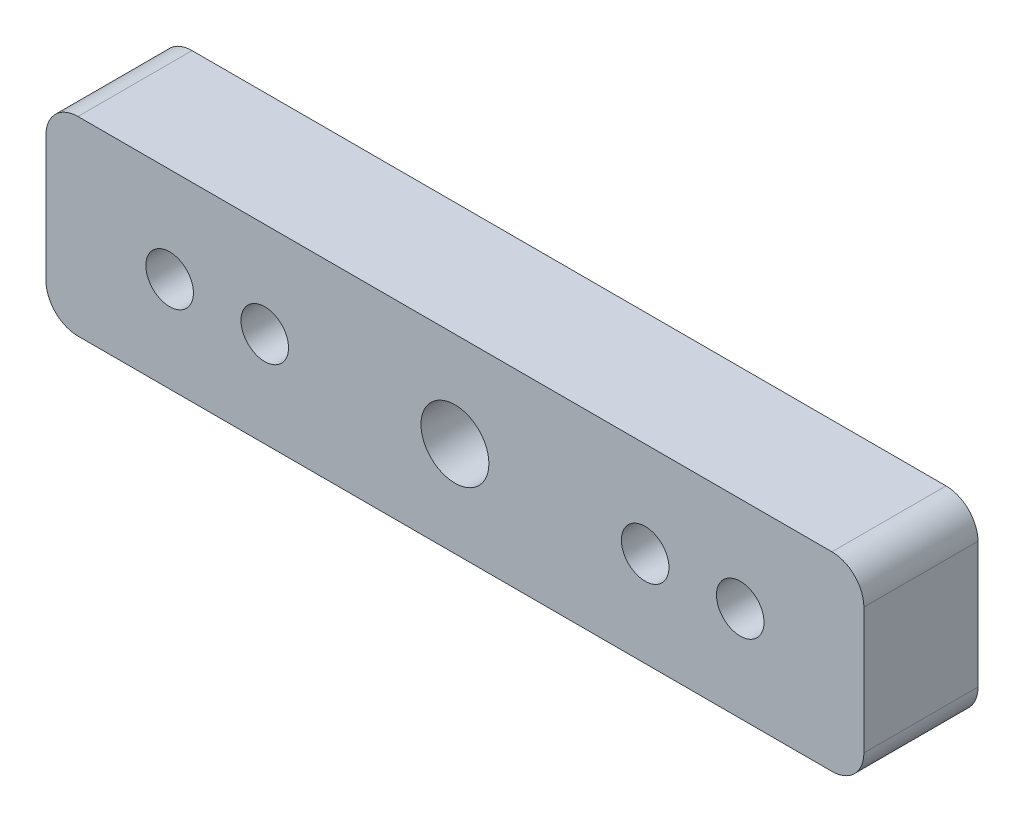
ISO-10303-21;
HEADER;
FILE_DESCRIPTION(('STEP AP214'),'2;1');
FILE_NAME('part.step','',(''),(''),'','','');
FILE_SCHEMA(('AUTOMOTIVE_DESIGN { 1 0 10303 214 1 1 1 1 }'));
ENDSEC;
DATA;
#1=APPLICATION_CONTEXT('core data for automotive mechanical design processes');
#2=APPLICATION_PROTOCOL_DEFINITION('international standard','automotive_design',2000,#1);
#3=PRODUCT_CONTEXT('',#1,'mechanical');
#4=PRODUCT('Part','Part','',(#3));
#5=PRODUCT_RELATED_PRODUCT_CATEGORY('part','',(#4));
#6=PRODUCT_DEFINITION_FORMATION('','',#4);
#7=PRODUCT_DEFINITION_CONTEXT('part definition',#1,'design');
#8=PRODUCT_DEFINITION('design','',#6,#7);
#9=PRODUCT_DEFINITION_SHAPE('','',#8);
#10=(LENGTH_UNIT() NAMED_UNIT(*) SI_UNIT(.MILLI.,.METRE.));
#11=(NAMED_UNIT(*) PLANE_ANGLE_UNIT() SI_UNIT($,.RADIAN.));
#12=(NAMED_UNIT(*) SI_UNIT($,.STERADIAN.) SOLID_ANGLE_UNIT());
#13=UNCERTAINTY_MEASURE_WITH_UNIT(LENGTH_MEASURE(1.E-05),#10,'distance_accuracy_value','');
#14=(GEOMETRIC_REPRESENTATION_CONTEXT(3) GLOBAL_UNCERTAINTY_ASSIGNED_CONTEXT((#13)) GLOBAL_UNIT_ASSIGNED_CONTEXT((#10,
#11,#12)) REPRESENTATION_CONTEXT('',''));
#15=CARTESIAN_POINT('',(0.,0.,0.));
#16=DIRECTION('',(0.,0.,1.));
#17=DIRECTION('',(1.,0.,0.));
#18=AXIS2_PLACEMENT_3D('',#15,#16,#17);
#19=CARTESIAN_POINT('',(39.64,6.64,6.));
#20=DIRECTION('',(0.,0.,-1.));
#21=DIRECTION('',(-1.,0.,0.));
#22=AXIS2_PLACEMENT_3D('',#19,#20,#21);
#23=PLANE('',#22);
#24=CARTESIAN_POINT('',(-20.,0.,6.));
#25=DIRECTION('',(0.,0.,1.));
#26=DIRECTION('',(1.,0.,0.));
#27=AXIS2_PLACEMENT_3D('',#24,#25,#26);
#28=CIRCLE('',#27,2.5);
#29=CARTESIAN_POINT('',(-17.5,0.,6.));
#30=VERTEX_POINT('',#29);
#31=EDGE_CURVE('E194',#30,#30,#28,.T.);
#32=ORIENTED_EDGE('',*,*,#31,.F.);
#33=EDGE_LOOP('',(#32));
#34=FACE_BOUND('',#33,.T.);
#35=CARTESIAN_POINT('',(0.,0.,6.));
#36=DIRECTION('',(0.,0.,1.));
#37=DIRECTION('',(1.,0.,0.));
#38=AXIS2_PLACEMENT_3D('',#35,#36,#37);
#39=CIRCLE('',#38,3.57);
#40=CARTESIAN_POINT('',(3.57,0.,6.));
#41=VERTEX_POINT('',#40);
#42=EDGE_CURVE('E182',#41,#41,#39,.T.);
#43=ORIENTED_EDGE('',*,*,#42,.F.);
#44=EDGE_LOOP('',(#43));
#45=FACE_BOUND('',#44,.T.);
#46=CARTESIAN_POINT('',(39.64,6.64,6.));
#47=DIRECTION('',(0.,0.,1.));
#48=DIRECTION('',(-1.,0.,0.));
#49=AXIS2_PLACEMENT_3D('',#46,#47,#48);
#50=CIRCLE('',#49,3.36);
#51=CARTESIAN_POINT('',(43.,6.63999999999998,6.));
#52=VERTEX_POINT('',#51);
#53=CARTESIAN_POINT('',(39.64,10.,6.));
#54=VERTEX_POINT('',#53);
#55=EDGE_CURVE('E145',#52,#54,#50,.T.);
#56=ORIENTED_EDGE('',*,*,#55,.T.);
#57=DIRECTION('',(-1.,0.,0.));
#58=VECTOR('',#57,1.);
#59=CARTESIAN_POINT('',(-39.64,10.,6.));
#60=LINE('',#59,#58);
#61=CARTESIAN_POINT('',(-39.64,10.,6.));
#62=VERTEX_POINT('',#61);
#63=EDGE_CURVE('E93',#54,#62,#60,.T.);
#64=ORIENTED_EDGE('',*,*,#63,.T.);
#65=CARTESIAN_POINT('',(-39.64,6.64,6.));
#66=DIRECTION('',(0.,0.,1.));
#67=DIRECTION('',(-1.,0.,0.));
#68=AXIS2_PLACEMENT_3D('',#65,#66,#67);
#69=CIRCLE('',#68,3.36);
#70=CARTESIAN_POINT('',(-43.,6.63999999999998,6.));
#71=VERTEX_POINT('',#70);
#72=EDGE_CURVE('E160',#62,#71,#69,.T.);
#73=ORIENTED_EDGE('',*,*,#72,.T.);
#74=DIRECTION('',(0.,-1.,0.));
#75=VECTOR('',#74,1.);
#76=CARTESIAN_POINT('',(-43.,-6.63999999999998,6.));
#77=LINE('',#76,#75);
#78=CARTESIAN_POINT('',(-43.,-6.63999999999998,6.));
#79=VERTEX_POINT('',#78);
#80=EDGE_CURVE('E173',#71,#79,#77,.T.);
#81=ORIENTED_EDGE('',*,*,#80,.T.);
#82=CARTESIAN_POINT('',(-39.64,-6.64,6.));
#83=DIRECTION('',(0.,0.,1.));
#84=DIRECTION('',(-1.,0.,0.));
#85=AXIS2_PLACEMENT_3D('',#82,#83,#84);
#86=CIRCLE('',#85,3.36);
#87=CARTESIAN_POINT('',(-39.64,-10.,6.));
#88=VERTEX_POINT('',#87);
#89=EDGE_CURVE('E112',#79,#88,#86,.T.);
#90=ORIENTED_EDGE('',*,*,#89,.T.);
#91=DIRECTION('',(1.,0.,0.));
#92=VECTOR('',#91,1.);
#93=CARTESIAN_POINT('',(-39.64,-10.,6.));
#94=LINE('',#93,#92);
#95=CARTESIAN_POINT('',(39.64,-10.,6.));
#96=VERTEX_POINT('',#95);
#97=EDGE_CURVE('E106',#88,#96,#94,.T.);
#98=ORIENTED_EDGE('',*,*,#97,.T.);
#99=CARTESIAN_POINT('',(39.64,-6.64,6.));
#100=DIRECTION('',(0.,0.,1.));
#101=DIRECTION('',(1.,0.,0.));
#102=AXIS2_PLACEMENT_3D('',#99,#100,#101);
#103=CIRCLE('',#102,3.36);
#104=CARTESIAN_POINT('',(43.,-6.63999999999998,6.));
#105=VERTEX_POINT('',#104);
#106=EDGE_CURVE('E110',#96,#105,#103,.T.);
#107=ORIENTED_EDGE('',*,*,#106,.T.);
#108=DIRECTION('',(0.,1.,0.));
#109=VECTOR('',#108,1.);
#110=CARTESIAN_POINT('',(43.,-6.63999999999998,6.));
#111=LINE('',#110,#109);
#112=EDGE_CURVE('E50',#105,#52,#111,.T.);
#113=ORIENTED_EDGE('',*,*,#112,.T.);
#114=EDGE_LOOP('',(#56,#64,#73,#81,#90,#98,#107,#113));
#115=FACE_BOUND('',#114,.T.);
#116=CARTESIAN_POINT('',(-30.,0.,6.));
#117=DIRECTION('',(0.,0.,1.));
#118=DIRECTION('',(1.,0.,0.));
#119=AXIS2_PLACEMENT_3D('',#116,#117,#118);
#120=CIRCLE('',#119,2.5);
#121=CARTESIAN_POINT('',(-27.5,0.,6.));
#122=VERTEX_POINT('',#121);
#123=EDGE_CURVE('E134',#122,#122,#120,.T.);
#124=ORIENTED_EDGE('',*,*,#123,.F.);
#125=EDGE_LOOP('',(#124));
#126=FACE_BOUND('',#125,.T.);
#127=CARTESIAN_POINT('',(30.,0.,6.));
#128=DIRECTION('',(0.,0.,1.));
#129=DIRECTION('',(1.,0.,0.));
#130=AXIS2_PLACEMENT_3D('',#127,#128,#129);
#131=CIRCLE('',#130,2.5);
#132=CARTESIAN_POINT('',(32.5,0.,6.));
#133=VERTEX_POINT('',#132);
#134=EDGE_CURVE('E188',#133,#133,#131,.T.);
#135=ORIENTED_EDGE('',*,*,#134,.F.);
#136=EDGE_LOOP('',(#135));
#137=FACE_BOUND('',#136,.T.);
#138=CARTESIAN_POINT('',(20.,0.,6.));
#139=DIRECTION('',(0.,0.,1.));
#140=DIRECTION('',(1.,0.,0.));
#141=AXIS2_PLACEMENT_3D('',#138,#139,#140);
#142=CIRCLE('',#141,2.5);
#143=CARTESIAN_POINT('',(22.5,0.,6.));
#144=VERTEX_POINT('',#143);
#145=EDGE_CURVE('E200',#144,#144,#142,.T.);
#146=ORIENTED_EDGE('',*,*,#145,.F.);
#147=EDGE_LOOP('',(#146));
#148=FACE_BOUND('',#147,.T.);
#149=ADVANCED_FACE('F33',(#34,#45,#115,#126,#137,#148),#23,.F.);
#150=CARTESIAN_POINT('',(39.64,6.64,-6.));
#151=DIRECTION('',(0.,0.,-1.));
#152=DIRECTION('',(-1.,0.,0.));
#153=AXIS2_PLACEMENT_3D('',#150,#151,#152);
#154=PLANE('',#153);
#155=CARTESIAN_POINT('',(-20.,0.,-6.));
#156=DIRECTION('',(0.,0.,1.));
#157=DIRECTION('',(1.,0.,0.));
#158=AXIS2_PLACEMENT_3D('',#155,#156,#157);
#159=CIRCLE('',#158,2.5);
#160=CARTESIAN_POINT('',(-17.5,0.,-6.));
#161=VERTEX_POINT('',#160);
#162=EDGE_CURVE('E197',#161,#161,#159,.T.);
#163=ORIENTED_EDGE('',*,*,#162,.T.);
#164=EDGE_LOOP('',(#163));
#165=FACE_BOUND('',#164,.T.);
#166=CARTESIAN_POINT('',(0.,0.,-6.));
#167=DIRECTION('',(0.,0.,1.));
#168=DIRECTION('',(1.,0.,0.));
#169=AXIS2_PLACEMENT_3D('',#166,#167,#168);
#170=CIRCLE('',#169,3.57);
#171=CARTESIAN_POINT('',(3.57,0.,-6.));
#172=VERTEX_POINT('',#171);
#173=EDGE_CURVE('E185',#172,#172,#170,.T.);
#174=ORIENTED_EDGE('',*,*,#173,.T.);
#175=EDGE_LOOP('',(#174));
#176=FACE_BOUND('',#175,.T.);
#177=CARTESIAN_POINT('',(39.64,6.64,-6.));
#178=DIRECTION('',(0.,0.,1.));
#179=DIRECTION('',(-1.,0.,0.));
#180=AXIS2_PLACEMENT_3D('',#177,#178,#179);
#181=CIRCLE('',#180,3.36);
#182=CARTESIAN_POINT('',(43.,6.63999999999998,-6.));
#183=VERTEX_POINT('',#182);
#184=CARTESIAN_POINT('',(39.64,10.,-6.));
#185=VERTEX_POINT('',#184);
#186=EDGE_CURVE('E130',#183,#185,#181,.T.);
#187=ORIENTED_EDGE('',*,*,#186,.F.);
#188=DIRECTION('',(0.,1.,0.));
#189=VECTOR('',#188,1.);
#190=CARTESIAN_POINT('',(43.,-6.63999999999998,-6.));
#191=LINE('',#190,#189);
#192=CARTESIAN_POINT('',(43.,-6.63999999999998,-6.));
#193=VERTEX_POINT('',#192);
#194=EDGE_CURVE('E85',#193,#183,#191,.T.);
#195=ORIENTED_EDGE('',*,*,#194,.F.);
#196=CARTESIAN_POINT('',(39.64,-6.64,-6.));
#197=DIRECTION('',(0.,0.,1.));
#198=DIRECTION('',(1.,0.,0.));
#199=AXIS2_PLACEMENT_3D('',#196,#197,#198);
#200=CIRCLE('',#199,3.36);
#201=CARTESIAN_POINT('',(39.64,-10.,-6.));
#202=VERTEX_POINT('',#201);
#203=EDGE_CURVE('E79',#202,#193,#200,.T.);
#204=ORIENTED_EDGE('',*,*,#203,.F.);
#205=DIRECTION('',(1.,0.,0.));
#206=VECTOR('',#205,1.);
#207=CARTESIAN_POINT('',(-39.64,-10.,-6.));
#208=LINE('',#207,#206);
#209=CARTESIAN_POINT('',(-39.64,-10.,-6.));
#210=VERTEX_POINT('',#209);
#211=EDGE_CURVE('E120',#210,#202,#208,.T.);
#212=ORIENTED_EDGE('',*,*,#211,.F.);
#213=CARTESIAN_POINT('',(-39.64,-6.64,-6.));
#214=DIRECTION('',(0.,0.,1.));
#215=DIRECTION('',(-1.,0.,0.));
#216=AXIS2_PLACEMENT_3D('',#213,#214,#215);
#217=CIRCLE('',#216,3.36);
#218=CARTESIAN_POINT('',(-43.,-6.63999999999998,-6.));
#219=VERTEX_POINT('',#218);
#220=EDGE_CURVE('E140',#219,#210,#217,.T.);
#221=ORIENTED_EDGE('',*,*,#220,.F.);
#222=DIRECTION('',(0.,-1.,0.));
#223=VECTOR('',#222,1.);
#224=CARTESIAN_POINT('',(-43.,-6.63999999999998,-6.));
#225=LINE('',#224,#223);
#226=CARTESIAN_POINT('',(-43.,6.63999999999998,-6.));
#227=VERTEX_POINT('',#226);
#228=EDGE_CURVE('E138',#227,#219,#225,.T.);
#229=ORIENTED_EDGE('',*,*,#228,.F.);
#230=CARTESIAN_POINT('',(-39.64,6.64,-6.));
#231=DIRECTION('',(0.,0.,1.));
#232=DIRECTION('',(-1.,0.,0.));
#233=AXIS2_PLACEMENT_3D('',#230,#231,#232);
#234=CIRCLE('',#233,3.36);
#235=CARTESIAN_POINT('',(-39.64,10.,-6.));
#236=VERTEX_POINT('',#235);
#237=EDGE_CURVE('E136',#236,#227,#234,.T.);
#238=ORIENTED_EDGE('',*,*,#237,.F.);
#239=DIRECTION('',(-1.,0.,0.));
#240=VECTOR('',#239,1.);
#241=CARTESIAN_POINT('',(-39.64,10.,-6.));
#242=LINE('',#241,#240);
#243=EDGE_CURVE('E133',#185,#236,#242,.T.);
#244=ORIENTED_EDGE('',*,*,#243,.F.);
#245=EDGE_LOOP('',(#187,#195,#204,#212,#221,#229,#238,#244));
#246=FACE_BOUND('',#245,.T.);
#247=CARTESIAN_POINT('',(-30.,0.,-6.));
#248=DIRECTION('',(0.,0.,1.));
#249=DIRECTION('',(1.,0.,0.));
#250=AXIS2_PLACEMENT_3D('',#247,#248,#249);
#251=CIRCLE('',#250,2.5);
#252=CARTESIAN_POINT('',(-27.5,0.,-6.));
#253=VERTEX_POINT('',#252);
#254=EDGE_CURVE('E179',#253,#253,#251,.T.);
#255=ORIENTED_EDGE('',*,*,#254,.T.);
#256=EDGE_LOOP('',(#255));
#257=FACE_BOUND('',#256,.T.);
#258=CARTESIAN_POINT('',(30.,0.,-6.));
#259=DIRECTION('',(0.,0.,1.));
#260=DIRECTION('',(1.,0.,0.));
#261=AXIS2_PLACEMENT_3D('',#258,#259,#260);
#262=CIRCLE('',#261,2.5);
#263=CARTESIAN_POINT('',(32.5,0.,-6.));
#264=VERTEX_POINT('',#263);
#265=EDGE_CURVE('E191',#264,#264,#262,.T.);
#266=ORIENTED_EDGE('',*,*,#265,.T.);
#267=EDGE_LOOP('',(#266));
#268=FACE_BOUND('',#267,.T.);
#269=CARTESIAN_POINT('',(20.,0.,-6.));
#270=DIRECTION('',(0.,0.,1.));
#271=DIRECTION('',(1.,0.,0.));
#272=AXIS2_PLACEMENT_3D('',#269,#270,#271);
#273=CIRCLE('',#272,2.5);
#274=CARTESIAN_POINT('',(22.5,0.,-6.));
#275=VERTEX_POINT('',#274);
#276=EDGE_CURVE('E203',#275,#275,#273,.T.);
#277=ORIENTED_EDGE('',*,*,#276,.T.);
#278=EDGE_LOOP('',(#277));
#279=FACE_BOUND('',#278,.T.);
#280=ADVANCED_FACE('F164',(#165,#176,#246,#257,#268,#279),#154,.T.);
#281=CARTESIAN_POINT('',(39.64,6.64,6.));
#282=DIRECTION('',(0.,0.,-1.));
#283=DIRECTION('',(-1.,0.,0.));
#284=AXIS2_PLACEMENT_3D('',#281,#282,#283);
#285=CYLINDRICAL_SURFACE('',#284,3.36);
#286=ORIENTED_EDGE('',*,*,#186,.T.);
#287=DIRECTION('',(0.,0.,-1.));
#288=VECTOR('',#287,1.);
#289=CARTESIAN_POINT('',(39.64,10.,6.));
#290=LINE('',#289,#288);
#291=EDGE_CURVE('E11',#54,#185,#290,.T.);
#292=ORIENTED_EDGE('',*,*,#291,.F.);
#293=ORIENTED_EDGE('',*,*,#55,.F.);
#294=DIRECTION('',(0.,0.,-1.));
#295=VECTOR('',#294,1.);
#296=CARTESIAN_POINT('',(43.,6.63999999999998,6.));
#297=LINE('',#296,#295);
#298=EDGE_CURVE('E126',#52,#183,#297,.T.);
#299=ORIENTED_EDGE('',*,*,#298,.T.);
#300=EDGE_LOOP('',(#286,#292,#293,#299));
#301=FACE_BOUND('',#300,.T.);
#302=ADVANCED_FACE('F35',(#301),#285,.T.);
#303=CARTESIAN_POINT('',(-39.64,10.,6.));
#304=DIRECTION('',(0.,-1.,0.));
#305=DIRECTION('',(0.,0.,-1.));
#306=AXIS2_PLACEMENT_3D('',#303,#304,#305);
#307=PLANE('',#306);
#308=ORIENTED_EDGE('',*,*,#243,.T.);
#309=DIRECTION('',(0.,0.,-1.));
#310=VECTOR('',#309,1.);
#311=CARTESIAN_POINT('',(-39.64,10.,6.));
#312=LINE('',#311,#310);
#313=EDGE_CURVE('E42',#62,#236,#312,.T.);
#314=ORIENTED_EDGE('',*,*,#313,.F.);
#315=ORIENTED_EDGE('',*,*,#63,.F.);
#316=ORIENTED_EDGE('',*,*,#291,.T.);
#317=EDGE_LOOP('',(#308,#314,#315,#316));
#318=FACE_BOUND('',#317,.T.);
#319=ADVANCED_FACE('F238',(#318),#307,.F.);
#320=CARTESIAN_POINT('',(-39.64,6.64,6.));
#321=DIRECTION('',(0.,0.,-1.));
#322=DIRECTION('',(-1.,0.,0.));
#323=AXIS2_PLACEMENT_3D('',#320,#321,#322);
#324=CYLINDRICAL_SURFACE('',#323,3.36);
#325=ORIENTED_EDGE('',*,*,#237,.T.);
#326=DIRECTION('',(0.,0.,-1.));
#327=VECTOR('',#326,1.);
#328=CARTESIAN_POINT('',(-43.,6.63999999999998,6.));
#329=LINE('',#328,#327);
#330=EDGE_CURVE('E152',#71,#227,#329,.T.);
#331=ORIENTED_EDGE('',*,*,#330,.F.);
#332=ORIENTED_EDGE('',*,*,#72,.F.);
#333=ORIENTED_EDGE('',*,*,#313,.T.);
#334=EDGE_LOOP('',(#325,#331,#332,#333));
#335=FACE_BOUND('',#334,.T.);
#336=ADVANCED_FACE('F158',(#335),#324,.T.);
#337=CARTESIAN_POINT('',(-43.,-6.63999999999998,6.));
#338=DIRECTION('',(1.,0.,0.));
#339=DIRECTION('',(0.,0.,-1.));
#340=AXIS2_PLACEMENT_3D('',#337,#338,#339);
#341=PLANE('',#340);
#342=ORIENTED_EDGE('',*,*,#228,.T.);
#343=DIRECTION('',(0.,0.,-1.));
#344=VECTOR('',#343,1.);
#345=CARTESIAN_POINT('',(-43.,-6.63999999999998,6.));
#346=LINE('',#345,#344);
#347=EDGE_CURVE('E149',#79,#219,#346,.T.);
#348=ORIENTED_EDGE('',*,*,#347,.F.);
#349=ORIENTED_EDGE('',*,*,#80,.F.);
#350=ORIENTED_EDGE('',*,*,#330,.T.);
#351=EDGE_LOOP('',(#342,#348,#349,#350));
#352=FACE_BOUND('',#351,.T.);
#353=ADVANCED_FACE('F169',(#352),#341,.F.);
#354=CARTESIAN_POINT('',(-39.64,-6.64,6.));
#355=DIRECTION('',(0.,0.,-1.));
#356=DIRECTION('',(-1.,0.,0.));
#357=AXIS2_PLACEMENT_3D('',#354,#355,#356);
#358=CYLINDRICAL_SURFACE('',#357,3.36);
#359=ORIENTED_EDGE('',*,*,#220,.T.);
#360=DIRECTION('',(0.,0.,-1.));
#361=VECTOR('',#360,1.);
#362=CARTESIAN_POINT('',(-39.64,-10.,6.));
#363=LINE('',#362,#361);
#364=EDGE_CURVE('E121',#88,#210,#363,.T.);
#365=ORIENTED_EDGE('',*,*,#364,.F.);
#366=ORIENTED_EDGE('',*,*,#89,.F.);
#367=ORIENTED_EDGE('',*,*,#347,.T.);
#368=EDGE_LOOP('',(#359,#365,#366,#367));
#369=FACE_BOUND('',#368,.T.);
#370=ADVANCED_FACE('F172',(#369),#358,.T.);
#371=CARTESIAN_POINT('',(-39.64,-10.,6.));
#372=DIRECTION('',(0.,1.,0.));
#373=DIRECTION('',(0.,0.,1.));
#374=AXIS2_PLACEMENT_3D('',#371,#372,#373);
#375=PLANE('',#374);
#376=ORIENTED_EDGE('',*,*,#211,.T.);
#377=DIRECTION('',(0.,0.,-1.));
#378=VECTOR('',#377,1.);
#379=CARTESIAN_POINT('',(39.64,-10.,6.));
#380=LINE('',#379,#378);
#381=EDGE_CURVE('E117',#96,#202,#380,.T.);
#382=ORIENTED_EDGE('',*,*,#381,.F.);
#383=ORIENTED_EDGE('',*,*,#97,.F.);
#384=ORIENTED_EDGE('',*,*,#364,.T.);
#385=EDGE_LOOP('',(#376,#382,#383,#384));
#386=FACE_BOUND('',#385,.T.);
#387=ADVANCED_FACE('F118',(#386),#375,.F.);
#388=CARTESIAN_POINT('',(39.64,-6.64,6.));
#389=DIRECTION('',(0.,0.,-1.));
#390=DIRECTION('',(-1.,0.,0.));
#391=AXIS2_PLACEMENT_3D('',#388,#389,#390);
#392=CYLINDRICAL_SURFACE('',#391,3.36);
#393=ORIENTED_EDGE('',*,*,#203,.T.);
#394=DIRECTION('',(0.,0.,-1.));
#395=VECTOR('',#394,1.);
#396=CARTESIAN_POINT('',(43.,-6.63999999999998,6.));
#397=LINE('',#396,#395);
#398=EDGE_CURVE('E122',#105,#193,#397,.T.);
#399=ORIENTED_EDGE('',*,*,#398,.F.);
#400=ORIENTED_EDGE('',*,*,#106,.F.);
#401=ORIENTED_EDGE('',*,*,#381,.T.);
#402=EDGE_LOOP('',(#393,#399,#400,#401));
#403=FACE_BOUND('',#402,.T.);
#404=ADVANCED_FACE('F124',(#403),#392,.T.);
#405=CARTESIAN_POINT('',(43.,-6.63999999999998,6.));
#406=DIRECTION('',(-1.,0.,0.));
#407=DIRECTION('',(0.,0.,1.));
#408=AXIS2_PLACEMENT_3D('',#405,#406,#407);
#409=PLANE('',#408);
#410=ORIENTED_EDGE('',*,*,#194,.T.);
#411=ORIENTED_EDGE('',*,*,#298,.F.);
#412=ORIENTED_EDGE('',*,*,#112,.F.);
#413=ORIENTED_EDGE('',*,*,#398,.T.);
#414=EDGE_LOOP('',(#410,#411,#412,#413));
#415=FACE_BOUND('',#414,.T.);
#416=ADVANCED_FACE('F226',(#415),#409,.F.);
#417=CARTESIAN_POINT('',(-30.,0.,6.));
#418=DIRECTION('',(0.,0.,-1.));
#419=DIRECTION('',(-1.,0.,0.));
#420=AXIS2_PLACEMENT_3D('',#417,#418,#419);
#421=CYLINDRICAL_SURFACE('',#420,2.5);
#422=ORIENTED_EDGE('',*,*,#123,.T.);
#423=EDGE_LOOP('',(#422));
#424=FACE_BOUND('',#423,.T.);
#425=ORIENTED_EDGE('',*,*,#254,.F.);
#426=EDGE_LOOP('',(#425));
#427=FACE_BOUND('',#426,.T.);
#428=ADVANCED_FACE('F223',(#424,#427),#421,.F.);
#429=CARTESIAN_POINT('',(0.,0.,6.));
#430=DIRECTION('',(0.,0.,-1.));
#431=DIRECTION('',(-1.,0.,0.));
#432=AXIS2_PLACEMENT_3D('',#429,#430,#431);
#433=CYLINDRICAL_SURFACE('',#432,3.57);
#434=ORIENTED_EDGE('',*,*,#42,.T.);
#435=EDGE_LOOP('',(#434));
#436=FACE_BOUND('',#435,.T.);
#437=ORIENTED_EDGE('',*,*,#173,.F.);
#438=EDGE_LOOP('',(#437));
#439=FACE_BOUND('',#438,.T.);
#440=ADVANCED_FACE('F302',(#436,#439),#433,.F.);
#441=CARTESIAN_POINT('',(30.,0.,6.));
#442=DIRECTION('',(0.,0.,-1.));
#443=DIRECTION('',(-1.,0.,0.));
#444=AXIS2_PLACEMENT_3D('',#441,#442,#443);
#445=CYLINDRICAL_SURFACE('',#444,2.5);
#446=ORIENTED_EDGE('',*,*,#134,.T.);
#447=EDGE_LOOP('',(#446));
#448=FACE_BOUND('',#447,.T.);
#449=ORIENTED_EDGE('',*,*,#265,.F.);
#450=EDGE_LOOP('',(#449));
#451=FACE_BOUND('',#450,.T.);
#452=ADVANCED_FACE('F310',(#448,#451),#445,.F.);
#453=CARTESIAN_POINT('',(-20.,0.,6.));
#454=DIRECTION('',(0.,0.,-1.));
#455=DIRECTION('',(-1.,0.,0.));
#456=AXIS2_PLACEMENT_3D('',#453,#454,#455);
#457=CYLINDRICAL_SURFACE('',#456,2.5);
#458=ORIENTED_EDGE('',*,*,#31,.T.);
#459=EDGE_LOOP('',(#458));
#460=FACE_BOUND('',#459,.T.);
#461=ORIENTED_EDGE('',*,*,#162,.F.);
#462=EDGE_LOOP('',(#461));
#463=FACE_BOUND('',#462,.T.);
#464=ADVANCED_FACE('F318',(#460,#463),#457,.F.);
#465=CARTESIAN_POINT('',(20.,0.,6.));
#466=DIRECTION('',(0.,0.,-1.));
#467=DIRECTION('',(-1.,0.,0.));
#468=AXIS2_PLACEMENT_3D('',#465,#466,#467);
#469=CYLINDRICAL_SURFACE('',#468,2.5);
#470=ORIENTED_EDGE('',*,*,#145,.T.);
#471=EDGE_LOOP('',(#470));
#472=FACE_BOUND('',#471,.T.);
#473=ORIENTED_EDGE('',*,*,#276,.F.);
#474=EDGE_LOOP('',(#473));
#475=FACE_BOUND('',#474,.T.);
#476=ADVANCED_FACE('F209',(#472,#475),#469,.F.);
#477=CLOSED_SHELL('',(#149,#280,#302,#319,#336,#353,#370,#387,#404,#416,#428,#440,#452,#464,#476));
#478=MANIFOLD_SOLID_BREP('B2',#477);
#479=ADVANCED_BREP_SHAPE_REPRESENTATION('',(#18,#478),#14);
#480=SHAPE_DEFINITION_REPRESENTATION(#9,#479);
ENDSEC;
END-ISO-10303-21;
